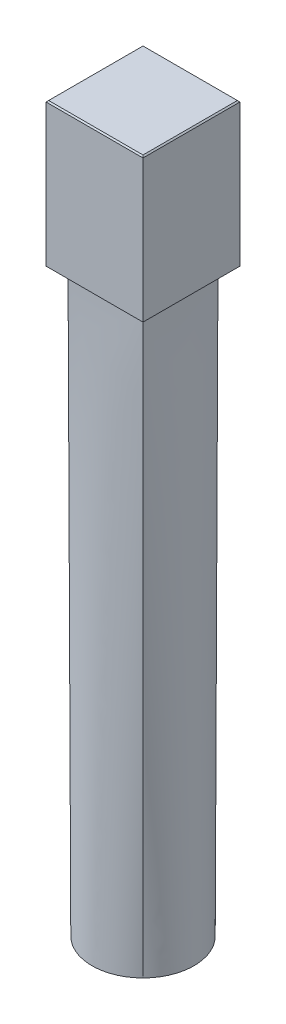
ISO-10303-21;
HEADER;
FILE_DESCRIPTION(('STEP AP214'),'2;1');
FILE_NAME('part.step','',(''),(''),'','','');
FILE_SCHEMA(('AUTOMOTIVE_DESIGN { 1 0 10303 214 1 1 1 1 }'));
ENDSEC;
DATA;
#1=APPLICATION_CONTEXT('core data for automotive mechanical design processes');
#2=APPLICATION_PROTOCOL_DEFINITION('international standard','automotive_design',2000,#1);
#3=PRODUCT_CONTEXT('',#1,'mechanical');
#4=PRODUCT('Part','Part','',(#3));
#5=PRODUCT_RELATED_PRODUCT_CATEGORY('part','',(#4));
#6=PRODUCT_DEFINITION_FORMATION('','',#4);
#7=PRODUCT_DEFINITION_CONTEXT('part definition',#1,'design');
#8=PRODUCT_DEFINITION('design','',#6,#7);
#9=PRODUCT_DEFINITION_SHAPE('','',#8);
#10=(LENGTH_UNIT() NAMED_UNIT(*) SI_UNIT(.MILLI.,.METRE.));
#11=(NAMED_UNIT(*) PLANE_ANGLE_UNIT() SI_UNIT($,.RADIAN.));
#12=(NAMED_UNIT(*) SI_UNIT($,.STERADIAN.) SOLID_ANGLE_UNIT());
#13=UNCERTAINTY_MEASURE_WITH_UNIT(LENGTH_MEASURE(1.E-05),#10,'distance_accuracy_value','');
#14=(GEOMETRIC_REPRESENTATION_CONTEXT(3) GLOBAL_UNCERTAINTY_ASSIGNED_CONTEXT((#13)) GLOBAL_UNIT_ASSIGNED_CONTEXT((#10,
#11,#12)) REPRESENTATION_CONTEXT('',''));
#15=CARTESIAN_POINT('',(0.,0.,0.));
#16=DIRECTION('',(0.,0.,1.));
#17=DIRECTION('',(1.,0.,0.));
#18=AXIS2_PLACEMENT_3D('',#15,#16,#17);
#19=CARTESIAN_POINT('',(0.,0.,0.));
#20=DIRECTION('',(0.,1.,0.));
#21=DIRECTION('',(0.,0.,1.));
#22=AXIS2_PLACEMENT_3D('',#19,#20,#21);
#23=PLANE('',#22);
#24=CARTESIAN_POINT('',(0.,0.,0.));
#25=DIRECTION('',(0.,1.,0.));
#26=DIRECTION('',(0.,0.,1.));
#27=AXIS2_PLACEMENT_3D('',#24,#25,#26);
#28=CIRCLE('',#27,1.975);
#29=CARTESIAN_POINT('',(-1.39653589284343,0.,-1.39653589284343));
#30=VERTEX_POINT('',#29);
#31=CARTESIAN_POINT('',(-1.39653589284343,0.,1.39653589284343));
#32=VERTEX_POINT('',#31);
#33=EDGE_CURVE('E172',#30,#32,#28,.T.);
#34=ORIENTED_EDGE('',*,*,#33,.F.);
#35=CARTESIAN_POINT('',(1.39653589284343,0.,-1.39653589284343));
#36=VERTEX_POINT('',#35);
#37=EDGE_CURVE('E250',#36,#30,#28,.T.);
#38=ORIENTED_EDGE('',*,*,#37,.F.);
#39=CARTESIAN_POINT('',(1.39653589284343,0.,1.39653589284343));
#40=VERTEX_POINT('',#39);
#41=EDGE_CURVE('E255',#40,#36,#28,.T.);
#42=ORIENTED_EDGE('',*,*,#41,.F.);
#43=EDGE_CURVE('E167',#32,#40,#28,.T.);
#44=ORIENTED_EDGE('',*,*,#43,.F.);
#45=EDGE_LOOP('',(#34,#38,#42,#44));
#46=FACE_BOUND('',#45,.T.);
#47=ADVANCED_FACE('F65',(#46),#23,.F.);
#48=CARTESIAN_POINT('',(1.39653589284343,0.,1.39653589284343));
#49=CARTESIAN_POINT('',(1.45,22.4,1.45));
#50=CARTESIAN_POINT('',(1.56111922617677,0.,1.2319525595101));
#51=CARTESIAN_POINT('',(1.45,22.4,1.20833333333333));
#52=CARTESIAN_POINT('',(1.70868822751565,0.,1.0243918987991));
#53=CARTESIAN_POINT('',(1.45,22.4,0.966666666666667));
#54=CARTESIAN_POINT('',(1.91639219058141,0.,0.544458623822229));
#55=CARTESIAN_POINT('',(1.45,22.4,0.483333333333333));
#56=CARTESIAN_POINT('',(1.975,0.,0.272690595228954));
#57=CARTESIAN_POINT('',(1.45,22.4,0.241666666666667));
#58=CARTESIAN_POINT('',(1.975,0.,-0.272690595228954));
#59=CARTESIAN_POINT('',(1.45,22.4,-0.241666666666667));
#60=CARTESIAN_POINT('',(1.91639219058141,0.,-0.544458623822229));
#61=CARTESIAN_POINT('',(1.45,22.4,-0.483333333333333));
#62=CARTESIAN_POINT('',(1.70868822751565,0.,-1.0243918987991));
#63=CARTESIAN_POINT('',(1.45,22.4,-0.966666666666667));
#64=CARTESIAN_POINT('',(1.56111922617677,0.,-1.2319525595101));
#65=CARTESIAN_POINT('',(1.45,22.4,-1.20833333333333));
#66=CARTESIAN_POINT('',(1.39653589284343,0.,-1.39653589284343));
#67=CARTESIAN_POINT('',(1.45,22.4,-1.45));
#68=B_SPLINE_SURFACE_WITH_KNOTS('',3,1,((#48,#49),(#50,#51),(#52,#53),(#54,#55),(#56,#57),(#58,
#59),(#60,#61),(#62,#63),(#64,#65),(#66,#67)),.UNSPECIFIED.,.F.,.F.,.F.,(4,2,2,2,4),(2,2),(0.,
0.25,0.5,0.75,1.),(0.,1.),.UNSPECIFIED.);
#69=DIRECTION('',(0.00238677690118345,0.999994303279798,-0.00238677690118346));
#70=VECTOR('',#69,1.);
#71=CARTESIAN_POINT('',(1.42326794642172,11.2,-1.42326794642172));
#72=LINE('',#71,#70);
#73=CARTESIAN_POINT('',(1.45,22.4,-1.45));
#74=VERTEX_POINT('',#73);
#75=EDGE_CURVE('E171',#36,#74,#72,.T.);
#76=DIRECTION('',(0.,0.,-1.));
#77=VECTOR('',#76,1.);
#78=CARTESIAN_POINT('',(1.45,22.4,1.45));
#79=LINE('',#78,#77);
#80=CARTESIAN_POINT('',(1.45,22.4,1.45));
#81=VERTEX_POINT('',#80);
#82=EDGE_CURVE('E176',#81,#74,#79,.T.);
#83=DIRECTION('',(-0.00238677690118345,-0.999994303279798,-0.00238677690118343));
#84=VECTOR('',#83,1.);
#85=CARTESIAN_POINT('',(1.42326794642172,11.2,1.42326794642172));
#86=LINE('',#85,#84);
#87=EDGE_CURVE('E159',#81,#40,#86,.T.);
#88=ORIENTED_EDGE('',*,*,#41,.T.);
#89=ORIENTED_EDGE('',*,*,#75,.T.);
#90=ORIENTED_EDGE('',*,*,#82,.F.);
#91=ORIENTED_EDGE('',*,*,#87,.T.);
#92=EDGE_LOOP('',(#88,#89,#90,#91));
#93=FACE_BOUND('',#92,.T.);
#94=ADVANCED_FACE('F178',(#93),#68,.T.);
#95=CARTESIAN_POINT('',(1.39653589284343,0.,-1.39653589284343));
#96=CARTESIAN_POINT('',(1.45,22.4,-1.45));
#97=CARTESIAN_POINT('',(1.2319525595101,0.,-1.56111922617676));
#98=CARTESIAN_POINT('',(1.20833333333333,22.4,-1.45));
#99=CARTESIAN_POINT('',(1.0243918987991,0.,-1.70868822751565));
#100=CARTESIAN_POINT('',(0.966666666666667,22.4,-1.45));
#101=CARTESIAN_POINT('',(0.544458623822229,0.,-1.91639219058141));
#102=CARTESIAN_POINT('',(0.483333333333333,22.4,-1.45));
#103=CARTESIAN_POINT('',(0.272690595228955,0.,-1.975));
#104=CARTESIAN_POINT('',(0.241666666666667,22.4,-1.45));
#105=CARTESIAN_POINT('',(-0.272690595228954,0.,-1.975));
#106=CARTESIAN_POINT('',(-0.241666666666667,22.4,-1.45));
#107=CARTESIAN_POINT('',(-0.544458623822229,0.,-1.91639219058141));
#108=CARTESIAN_POINT('',(-0.483333333333333,22.4,-1.45));
#109=CARTESIAN_POINT('',(-1.0243918987991,0.,-1.70868822751565));
#110=CARTESIAN_POINT('',(-0.966666666666666,22.4,-1.45));
#111=CARTESIAN_POINT('',(-1.2319525595101,0.,-1.56111922617677));
#112=CARTESIAN_POINT('',(-1.20833333333333,22.4,-1.45));
#113=CARTESIAN_POINT('',(-1.39653589284343,0.,-1.39653589284343));
#114=CARTESIAN_POINT('',(-1.45,22.4,-1.45));
#115=B_SPLINE_SURFACE_WITH_KNOTS('',3,1,((#95,#96),(#97,#98),(#99,#100),(#101,#102),(#103,#104),
(#105,#106),(#107,#108),(#109,#110),(#111,#112),(#113,#114)),.UNSPECIFIED.,.F.,.F.,.F.,(4,2,2,2,
4),(2,2),(0.,0.25,0.5,0.75,1.),(0.,1.),.UNSPECIFIED.);
#116=DIRECTION('',(-0.00238677690118344,0.999994303279798,-0.00238677690118344));
#117=VECTOR('',#116,1.);
#118=CARTESIAN_POINT('',(-1.42326794642172,11.2,-1.42326794642172));
#119=LINE('',#118,#117);
#120=CARTESIAN_POINT('',(-1.45,22.4,-1.45));
#121=VERTEX_POINT('',#120);
#122=EDGE_CURVE('E503',#30,#121,#119,.T.);
#123=DIRECTION('',(-1.,0.,0.));
#124=VECTOR('',#123,1.);
#125=CARTESIAN_POINT('',(-1.45,22.4,-1.45));
#126=LINE('',#125,#124);
#127=EDGE_CURVE('E183',#74,#121,#126,.T.);
#128=ORIENTED_EDGE('',*,*,#37,.T.);
#129=ORIENTED_EDGE('',*,*,#122,.T.);
#130=ORIENTED_EDGE('',*,*,#127,.F.);
#131=ORIENTED_EDGE('',*,*,#75,.F.);
#132=EDGE_LOOP('',(#128,#129,#130,#131));
#133=FACE_BOUND('',#132,.T.);
#134=ADVANCED_FACE('F423',(#133),#115,.T.);
#135=CARTESIAN_POINT('',(-1.39653589284343,0.,1.39653589284343));
#136=CARTESIAN_POINT('',(-1.45,22.4,1.45));
#137=CARTESIAN_POINT('',(-1.2319525595101,0.,1.56111922617677));
#138=CARTESIAN_POINT('',(-1.20833333333333,22.4,1.45));
#139=CARTESIAN_POINT('',(-1.0243918987991,0.,1.70868822751565));
#140=CARTESIAN_POINT('',(-0.966666666666667,22.4,1.45));
#141=CARTESIAN_POINT('',(-0.544458623822229,0.,1.91639219058141));
#142=CARTESIAN_POINT('',(-0.483333333333334,22.4,1.45));
#143=CARTESIAN_POINT('',(-0.272690595228954,0.,1.975));
#144=CARTESIAN_POINT('',(-0.241666666666668,22.4,1.45));
#145=CARTESIAN_POINT('',(0.272690595228954,0.,1.975));
#146=CARTESIAN_POINT('',(0.241666666666666,22.4,1.45));
#147=CARTESIAN_POINT('',(0.544458623822229,0.,1.91639219058141));
#148=CARTESIAN_POINT('',(0.483333333333333,22.4,1.45));
#149=CARTESIAN_POINT('',(1.0243918987991,0.,1.70868822751565));
#150=CARTESIAN_POINT('',(0.966666666666666,22.4,1.45));
#151=CARTESIAN_POINT('',(1.2319525595101,0.,1.56111922617677));
#152=CARTESIAN_POINT('',(1.20833333333333,22.4,1.45));
#153=CARTESIAN_POINT('',(1.39653589284343,0.,1.39653589284343));
#154=CARTESIAN_POINT('',(1.45,22.4,1.45));
#155=B_SPLINE_SURFACE_WITH_KNOTS('',3,1,((#135,#136),(#137,#138),(#139,#140),(#141,#142),(#143,
#144),(#145,#146),(#147,#148),(#149,#150),(#151,#152),(#153,#154)),.UNSPECIFIED.,.F.,.F.,.F.,(4,
2,2,2,4),(2,2),(0.,0.25,0.5,0.75,1.),(0.,1.),.UNSPECIFIED.);
#156=DIRECTION('',(1.,0.,0.));
#157=VECTOR('',#156,1.);
#158=CARTESIAN_POINT('',(-1.45,22.4,1.45));
#159=LINE('',#158,#157);
#160=CARTESIAN_POINT('',(-1.45,22.4,1.45));
#161=VERTEX_POINT('',#160);
#162=EDGE_CURVE('E163',#161,#81,#159,.T.);
#163=DIRECTION('',(-0.00238677690118342,0.999994303279798,0.00238677690118345));
#164=VECTOR('',#163,1.);
#165=CARTESIAN_POINT('',(-1.42326794642172,11.2,1.42326794642172));
#166=LINE('',#165,#164);
#167=EDGE_CURVE('E184',#32,#161,#166,.T.);
#168=ORIENTED_EDGE('',*,*,#43,.T.);
#169=ORIENTED_EDGE('',*,*,#87,.F.);
#170=ORIENTED_EDGE('',*,*,#162,.F.);
#171=ORIENTED_EDGE('',*,*,#167,.F.);
#172=EDGE_LOOP('',(#168,#169,#170,#171));
#173=FACE_BOUND('',#172,.T.);
#174=ADVANCED_FACE('F161',(#173),#155,.T.);
#175=CARTESIAN_POINT('',(-1.39653589284343,0.,-1.39653589284343));
#176=CARTESIAN_POINT('',(-1.45,22.4,-1.45));
#177=CARTESIAN_POINT('',(-1.56111922617676,0.,-1.2319525595101));
#178=CARTESIAN_POINT('',(-1.45,22.4,-1.20833333333333));
#179=CARTESIAN_POINT('',(-1.70868822751565,0.,-1.0243918987991));
#180=CARTESIAN_POINT('',(-1.45,22.4,-0.966666666666669));
#181=CARTESIAN_POINT('',(-1.91639219058141,0.,-0.54445862382223));
#182=CARTESIAN_POINT('',(-1.45,22.4,-0.483333333333338));
#183=CARTESIAN_POINT('',(-1.975,0.,-0.272690595228955));
#184=CARTESIAN_POINT('',(-1.45,22.4,-0.241666666666672));
#185=CARTESIAN_POINT('',(-1.975,0.,0.272690595228954));
#186=CARTESIAN_POINT('',(-1.45,22.4,0.241666666666662));
#187=CARTESIAN_POINT('',(-1.91639219058141,0.,0.544458623822229));
#188=CARTESIAN_POINT('',(-1.45,22.4,0.483333333333329));
#189=CARTESIAN_POINT('',(-1.70868822751565,0.,1.0243918987991));
#190=CARTESIAN_POINT('',(-1.45,22.4,0.966666666666664));
#191=CARTESIAN_POINT('',(-1.56111922617676,0.,1.2319525595101));
#192=CARTESIAN_POINT('',(-1.45,22.4,1.20833333333333));
#193=CARTESIAN_POINT('',(-1.39653589284343,0.,1.39653589284343));
#194=CARTESIAN_POINT('',(-1.45,22.4,1.45));
#195=B_SPLINE_SURFACE_WITH_KNOTS('',3,1,((#175,#176),(#177,#178),(#179,#180),(#181,#182),(#183,
#184),(#185,#186),(#187,#188),(#189,#190),(#191,#192),(#193,#194)),.UNSPECIFIED.,.F.,.F.,.F.,(4,
2,2,2,4),(2,2),(0.,0.25,0.5,0.75,1.),(0.,1.),.UNSPECIFIED.);
#196=DIRECTION('',(0.,0.,1.));
#197=VECTOR('',#196,1.);
#198=CARTESIAN_POINT('',(-1.45,22.4,1.45));
#199=LINE('',#198,#197);
#200=EDGE_CURVE('E190',#121,#161,#199,.T.);
#201=ORIENTED_EDGE('',*,*,#33,.T.);
#202=ORIENTED_EDGE('',*,*,#167,.T.);
#203=ORIENTED_EDGE('',*,*,#200,.F.);
#204=ORIENTED_EDGE('',*,*,#122,.F.);
#205=EDGE_LOOP('',(#201,#202,#203,#204));
#206=FACE_BOUND('',#205,.T.);
#207=ADVANCED_FACE('F414',(#206),#195,.T.);
#208=CARTESIAN_POINT('',(1.875,28.,1.875));
#209=DIRECTION('',(-1.,0.,0.));
#210=DIRECTION('',(0.,0.,1.));
#211=AXIS2_PLACEMENT_3D('',#208,#209,#210);
#212=PLANE('',#211);
#213=DIRECTION('',(0.,-1.,0.));
#214=VECTOR('',#213,1.);
#215=CARTESIAN_POINT('',(1.875,28.,1.875));
#216=LINE('',#215,#214);
#217=CARTESIAN_POINT('',(1.875,27.95,1.875));
#218=VERTEX_POINT('',#217);
#219=CARTESIAN_POINT('',(1.875,22.45,1.875));
#220=VERTEX_POINT('',#219);
#221=EDGE_CURVE('E345',#218,#220,#216,.T.);
#222=ORIENTED_EDGE('',*,*,#221,.T.);
#223=DIRECTION('',(0.,0.,-1.));
#224=VECTOR('',#223,1.);
#225=CARTESIAN_POINT('',(1.875,22.45,-1.875));
#226=LINE('',#225,#224);
#227=CARTESIAN_POINT('',(1.875,22.45,-1.875));
#228=VERTEX_POINT('',#227);
#229=EDGE_CURVE('E306',#220,#228,#226,.T.);
#230=ORIENTED_EDGE('',*,*,#229,.T.);
#231=DIRECTION('',(0.,-1.,0.));
#232=VECTOR('',#231,1.);
#233=CARTESIAN_POINT('',(1.875,28.,-1.875));
#234=LINE('',#233,#232);
#235=CARTESIAN_POINT('',(1.875,27.95,-1.875));
#236=VERTEX_POINT('',#235);
#237=EDGE_CURVE('E196',#236,#228,#234,.T.);
#238=ORIENTED_EDGE('',*,*,#237,.F.);
#239=DIRECTION('',(0.,0.,1.));
#240=VECTOR('',#239,1.);
#241=CARTESIAN_POINT('',(1.875,27.95,1.875));
#242=LINE('',#241,#240);
#243=EDGE_CURVE('E192',#236,#218,#242,.T.);
#244=ORIENTED_EDGE('',*,*,#243,.T.);
#245=EDGE_LOOP('',(#222,#230,#238,#244));
#246=FACE_BOUND('',#245,.T.);
#247=ADVANCED_FACE('F274',(#246),#212,.F.);
#248=CARTESIAN_POINT('',(-1.875,28.,-1.875));
#249=DIRECTION('',(0.,0.,1.));
#250=DIRECTION('',(1.,0.,0.));
#251=AXIS2_PLACEMENT_3D('',#248,#249,#250);
#252=PLANE('',#251);
#253=ORIENTED_EDGE('',*,*,#237,.T.);
#254=DIRECTION('',(-1.,0.,0.));
#255=VECTOR('',#254,1.);
#256=CARTESIAN_POINT('',(-1.875,22.45,-1.875));
#257=LINE('',#256,#255);
#258=CARTESIAN_POINT('',(-1.875,22.45,-1.875));
#259=VERTEX_POINT('',#258);
#260=EDGE_CURVE('E320',#228,#259,#257,.T.);
#261=ORIENTED_EDGE('',*,*,#260,.T.);
#262=DIRECTION('',(0.,-1.,0.));
#263=VECTOR('',#262,1.);
#264=CARTESIAN_POINT('',(-1.875,28.,-1.875));
#265=LINE('',#264,#263);
#266=CARTESIAN_POINT('',(-1.875,27.95,-1.875));
#267=VERTEX_POINT('',#266);
#268=EDGE_CURVE('E367',#267,#259,#265,.T.);
#269=ORIENTED_EDGE('',*,*,#268,.F.);
#270=DIRECTION('',(1.,0.,0.));
#271=VECTOR('',#270,1.);
#272=CARTESIAN_POINT('',(-1.875,27.95,-1.875));
#273=LINE('',#272,#271);
#274=EDGE_CURVE('E318',#267,#236,#273,.T.);
#275=ORIENTED_EDGE('',*,*,#274,.T.);
#276=EDGE_LOOP('',(#253,#261,#269,#275));
#277=FACE_BOUND('',#276,.T.);
#278=ADVANCED_FACE('F365',(#277),#252,.F.);
#279=CARTESIAN_POINT('',(-1.875,28.,1.875));
#280=DIRECTION('',(1.,0.,0.));
#281=DIRECTION('',(0.,0.,-1.));
#282=AXIS2_PLACEMENT_3D('',#279,#280,#281);
#283=PLANE('',#282);
#284=ORIENTED_EDGE('',*,*,#268,.T.);
#285=DIRECTION('',(0.,0.,1.));
#286=VECTOR('',#285,1.);
#287=CARTESIAN_POINT('',(-1.875,22.45,1.875));
#288=LINE('',#287,#286);
#289=CARTESIAN_POINT('',(-1.875,22.45,1.875));
#290=VERTEX_POINT('',#289);
#291=EDGE_CURVE('E324',#259,#290,#288,.T.);
#292=ORIENTED_EDGE('',*,*,#291,.T.);
#293=DIRECTION('',(0.,-1.,0.));
#294=VECTOR('',#293,1.);
#295=CARTESIAN_POINT('',(-1.875,28.,1.875));
#296=LINE('',#295,#294);
#297=CARTESIAN_POINT('',(-1.875,27.95,1.875));
#298=VERTEX_POINT('',#297);
#299=EDGE_CURVE('E373',#298,#290,#296,.T.);
#300=ORIENTED_EDGE('',*,*,#299,.F.);
#301=DIRECTION('',(0.,0.,-1.));
#302=VECTOR('',#301,1.);
#303=CARTESIAN_POINT('',(-1.875,27.95,1.875));
#304=LINE('',#303,#302);
#305=EDGE_CURVE('E322',#298,#267,#304,.T.);
#306=ORIENTED_EDGE('',*,*,#305,.T.);
#307=EDGE_LOOP('',(#284,#292,#300,#306));
#308=FACE_BOUND('',#307,.T.);
#309=ADVANCED_FACE('F398',(#308),#283,.F.);
#310=CARTESIAN_POINT('',(-1.875,28.,1.875));
#311=DIRECTION('',(0.,0.,-1.));
#312=DIRECTION('',(-1.,0.,0.));
#313=AXIS2_PLACEMENT_3D('',#310,#311,#312);
#314=PLANE('',#313);
#315=ORIENTED_EDGE('',*,*,#299,.T.);
#316=DIRECTION('',(1.,0.,0.));
#317=VECTOR('',#316,1.);
#318=CARTESIAN_POINT('',(1.875,22.45,1.875));
#319=LINE('',#318,#317);
#320=EDGE_CURVE('E329',#290,#220,#319,.T.);
#321=ORIENTED_EDGE('',*,*,#320,.T.);
#322=ORIENTED_EDGE('',*,*,#221,.F.);
#323=DIRECTION('',(-1.,0.,0.));
#324=VECTOR('',#323,1.);
#325=CARTESIAN_POINT('',(-1.875,27.95,1.875));
#326=LINE('',#325,#324);
#327=EDGE_CURVE('E326',#218,#298,#326,.T.);
#328=ORIENTED_EDGE('',*,*,#327,.T.);
#329=EDGE_LOOP('',(#315,#321,#322,#328));
#330=FACE_BOUND('',#329,.T.);
#331=ADVANCED_FACE('F214',(#330),#314,.F.);
#332=CARTESIAN_POINT('',(0.,28.,0.));
#333=DIRECTION('',(0.,-1.,0.));
#334=DIRECTION('',(0.,0.,-1.));
#335=AXIS2_PLACEMENT_3D('',#332,#333,#334);
#336=PLANE('',#335);
#337=DIRECTION('',(0.,0.,1.));
#338=VECTOR('',#337,1.);
#339=CARTESIAN_POINT('',(-1.825,28.,0.));
#340=LINE('',#339,#338);
#341=CARTESIAN_POINT('',(-1.825,28.,-1.825));
#342=VERTEX_POINT('',#341);
#343=CARTESIAN_POINT('',(-1.825,28.,1.82499999999999));
#344=VERTEX_POINT('',#343);
#345=EDGE_CURVE('E90',#342,#344,#340,.T.);
#346=ORIENTED_EDGE('',*,*,#345,.T.);
#347=DIRECTION('',(1.,0.,0.));
#348=VECTOR('',#347,1.);
#349=CARTESIAN_POINT('',(0.,28.,1.82499999999999));
#350=LINE('',#349,#348);
#351=CARTESIAN_POINT('',(1.82499999999999,28.,1.82499999999999));
#352=VERTEX_POINT('',#351);
#353=EDGE_CURVE('E12',#344,#352,#350,.T.);
#354=ORIENTED_EDGE('',*,*,#353,.T.);
#355=DIRECTION('',(0.,0.,-1.));
#356=VECTOR('',#355,1.);
#357=CARTESIAN_POINT('',(1.82499999999999,28.,0.));
#358=LINE('',#357,#356);
#359=CARTESIAN_POINT('',(1.82499999999999,28.,-1.825));
#360=VERTEX_POINT('',#359);
#361=EDGE_CURVE('E75',#352,#360,#358,.T.);
#362=ORIENTED_EDGE('',*,*,#361,.T.);
#363=DIRECTION('',(-1.,0.,0.));
#364=VECTOR('',#363,1.);
#365=CARTESIAN_POINT('',(0.,28.,-1.825));
#366=LINE('',#365,#364);
#367=EDGE_CURVE('E331',#360,#342,#366,.T.);
#368=ORIENTED_EDGE('',*,*,#367,.T.);
#369=EDGE_LOOP('',(#346,#354,#362,#368));
#370=FACE_BOUND('',#369,.T.);
#371=ADVANCED_FACE('F212',(#370),#336,.F.);
#372=CARTESIAN_POINT('',(0.,22.4,0.));
#373=DIRECTION('',(0.,-1.,0.));
#374=DIRECTION('',(0.,0.,-1.));
#375=AXIS2_PLACEMENT_3D('',#372,#373,#374);
#376=PLANE('',#375);
#377=DIRECTION('',(1.,0.,0.));
#378=VECTOR('',#377,1.);
#379=CARTESIAN_POINT('',(1.875,22.4,-1.825));
#380=LINE('',#379,#378);
#381=CARTESIAN_POINT('',(-1.825,22.4,-1.825));
#382=VERTEX_POINT('',#381);
#383=CARTESIAN_POINT('',(1.825,22.4,-1.825));
#384=VERTEX_POINT('',#383);
#385=EDGE_CURVE('E313',#382,#384,#380,.T.);
#386=ORIENTED_EDGE('',*,*,#385,.T.);
#387=DIRECTION('',(0.,0.,1.));
#388=VECTOR('',#387,1.);
#389=CARTESIAN_POINT('',(1.825,22.4,1.875));
#390=LINE('',#389,#388);
#391=CARTESIAN_POINT('',(1.825,22.4,1.825));
#392=VERTEX_POINT('',#391);
#393=EDGE_CURVE('E315',#384,#392,#390,.T.);
#394=ORIENTED_EDGE('',*,*,#393,.T.);
#395=DIRECTION('',(-1.,0.,0.));
#396=VECTOR('',#395,1.);
#397=CARTESIAN_POINT('',(-1.875,22.4,1.825));
#398=LINE('',#397,#396);
#399=CARTESIAN_POINT('',(-1.825,22.4,1.825));
#400=VERTEX_POINT('',#399);
#401=EDGE_CURVE('E309',#392,#400,#398,.T.);
#402=ORIENTED_EDGE('',*,*,#401,.T.);
#403=DIRECTION('',(0.,0.,-1.));
#404=VECTOR('',#403,1.);
#405=CARTESIAN_POINT('',(-1.825,22.4,-1.875));
#406=LINE('',#405,#404);
#407=EDGE_CURVE('E311',#400,#382,#406,.T.);
#408=ORIENTED_EDGE('',*,*,#407,.T.);
#409=EDGE_LOOP('',(#386,#394,#402,#408));
#410=FACE_BOUND('',#409,.T.);
#411=ORIENTED_EDGE('',*,*,#162,.T.);
#412=ORIENTED_EDGE('',*,*,#82,.T.);
#413=ORIENTED_EDGE('',*,*,#127,.T.);
#414=ORIENTED_EDGE('',*,*,#200,.T.);
#415=EDGE_LOOP('',(#411,#412,#413,#414));
#416=FACE_BOUND('',#415,.T.);
#417=ADVANCED_FACE('F189',(#410,#416),#376,.T.);
#418=CARTESIAN_POINT('',(-1.875,22.45,1.875));
#419=DIRECTION('',(-0.707106781186548,-0.707106781186548,0.));
#420=DIRECTION('',(0.,0.,-1.));
#421=AXIS2_PLACEMENT_3D('',#418,#419,#420);
#422=PLANE('',#421);
#423=DIRECTION('',(0.577350269189626,-0.577350269189626,0.577350269189626));
#424=VECTOR('',#423,1.);
#425=CARTESIAN_POINT('',(-0.625,21.2,-0.625));
#426=LINE('',#425,#424);
#427=EDGE_CURVE('E339',#382,#259,#426,.F.);
#428=ORIENTED_EDGE('',*,*,#427,.F.);
#429=ORIENTED_EDGE('',*,*,#407,.F.);
#430=DIRECTION('',(0.577350269189626,-0.577350269189626,-0.577350269189626));
#431=VECTOR('',#430,1.);
#432=CARTESIAN_POINT('',(-1.875,22.45,1.875));
#433=LINE('',#432,#431);
#434=EDGE_CURVE('E342',#290,#400,#433,.T.);
#435=ORIENTED_EDGE('',*,*,#434,.F.);
#436=ORIENTED_EDGE('',*,*,#291,.F.);
#437=EDGE_LOOP('',(#428,#429,#435,#436));
#438=FACE_BOUND('',#437,.T.);
#439=ADVANCED_FACE('F211',(#438),#422,.T.);
#440=CARTESIAN_POINT('',(-1.875,22.45,1.875));
#441=DIRECTION('',(0.,-0.707106781186548,0.707106781186548));
#442=DIRECTION('',(-1.,0.,0.));
#443=AXIS2_PLACEMENT_3D('',#440,#441,#442);
#444=PLANE('',#443);
#445=ORIENTED_EDGE('',*,*,#434,.T.);
#446=ORIENTED_EDGE('',*,*,#401,.F.);
#447=DIRECTION('',(0.577350269189626,0.577350269189626,0.577350269189626));
#448=VECTOR('',#447,1.);
#449=CARTESIAN_POINT('',(0.624999999999999,21.2,0.625));
#450=LINE('',#449,#448);
#451=EDGE_CURVE('E337',#220,#392,#450,.F.);
#452=ORIENTED_EDGE('',*,*,#451,.F.);
#453=ORIENTED_EDGE('',*,*,#320,.F.);
#454=EDGE_LOOP('',(#445,#446,#452,#453));
#455=FACE_BOUND('',#454,.T.);
#456=ADVANCED_FACE('F384',(#455),#444,.T.);
#457=CARTESIAN_POINT('',(-1.875,22.45,-1.875));
#458=DIRECTION('',(0.,-0.707106781186548,-0.707106781186548));
#459=DIRECTION('',(1.,0.,0.));
#460=AXIS2_PLACEMENT_3D('',#457,#458,#459);
#461=PLANE('',#460);
#462=ORIENTED_EDGE('',*,*,#427,.T.);
#463=ORIENTED_EDGE('',*,*,#260,.F.);
#464=DIRECTION('',(-0.577350269189626,-0.577350269189626,0.577350269189626));
#465=VECTOR('',#464,1.);
#466=CARTESIAN_POINT('',(0.624999999999999,21.2,-0.625));
#467=LINE('',#466,#465);
#468=EDGE_CURVE('E335',#384,#228,#467,.F.);
#469=ORIENTED_EDGE('',*,*,#468,.F.);
#470=ORIENTED_EDGE('',*,*,#385,.F.);
#471=EDGE_LOOP('',(#462,#463,#469,#470));
#472=FACE_BOUND('',#471,.T.);
#473=ADVANCED_FACE('F392',(#472),#461,.T.);
#474=CARTESIAN_POINT('',(1.875,22.45,1.875));
#475=DIRECTION('',(0.707106781186548,-0.707106781186548,0.));
#476=DIRECTION('',(0.,0.,1.));
#477=AXIS2_PLACEMENT_3D('',#474,#475,#476);
#478=PLANE('',#477);
#479=ORIENTED_EDGE('',*,*,#451,.T.);
#480=ORIENTED_EDGE('',*,*,#393,.F.);
#481=ORIENTED_EDGE('',*,*,#468,.T.);
#482=ORIENTED_EDGE('',*,*,#229,.F.);
#483=EDGE_LOOP('',(#479,#480,#481,#482));
#484=FACE_BOUND('',#483,.T.);
#485=ADVANCED_FACE('F387',(#484),#478,.T.);
#486=CARTESIAN_POINT('',(0.,28.,-1.825));
#487=DIRECTION('',(0.,-0.707106781186548,0.707106781186548));
#488=DIRECTION('',(-1.,0.,0.));
#489=AXIS2_PLACEMENT_3D('',#486,#487,#488);
#490=PLANE('',#489);
#491=DIRECTION('',(0.577350269189626,-0.577350269189626,-0.577350269189626));
#492=VECTOR('',#491,1.);
#493=CARTESIAN_POINT('',(1.21666666666666,28.6083333333333,-1.21666666666666));
#494=LINE('',#493,#492);
#495=EDGE_CURVE('E348',#236,#360,#494,.F.);
#496=ORIENTED_EDGE('',*,*,#495,.F.);
#497=ORIENTED_EDGE('',*,*,#274,.F.);
#498=DIRECTION('',(0.577350269189626,0.577350269189626,0.577350269189626));
#499=VECTOR('',#498,1.);
#500=CARTESIAN_POINT('',(-1.21666666666666,28.6083333333333,-1.21666666666666));
#501=LINE('',#500,#499);
#502=EDGE_CURVE('E70',#342,#267,#501,.F.);
#503=ORIENTED_EDGE('',*,*,#502,.F.);
#504=ORIENTED_EDGE('',*,*,#367,.F.);
#505=EDGE_LOOP('',(#496,#497,#503,#504));
#506=FACE_BOUND('',#505,.T.);
#507=ADVANCED_FACE('F68',(#506),#490,.F.);
#508=CARTESIAN_POINT('',(-1.825,28.,0.));
#509=DIRECTION('',(0.707106781186548,-0.707106781186548,0.));
#510=DIRECTION('',(0.,0.,1.));
#511=AXIS2_PLACEMENT_3D('',#508,#509,#510);
#512=PLANE('',#511);
#513=ORIENTED_EDGE('',*,*,#502,.T.);
#514=ORIENTED_EDGE('',*,*,#305,.F.);
#515=DIRECTION('',(0.577350269189626,0.577350269189626,-0.577350269189626));
#516=VECTOR('',#515,1.);
#517=CARTESIAN_POINT('',(-1.21666666666666,28.6083333333333,1.21666666666666));
#518=LINE('',#517,#516);
#519=EDGE_CURVE('E347',#344,#298,#518,.F.);
#520=ORIENTED_EDGE('',*,*,#519,.F.);
#521=ORIENTED_EDGE('',*,*,#345,.F.);
#522=EDGE_LOOP('',(#513,#514,#520,#521));
#523=FACE_BOUND('',#522,.T.);
#524=ADVANCED_FACE('F357',(#523),#512,.F.);
#525=CARTESIAN_POINT('',(1.82499999999999,28.,0.));
#526=DIRECTION('',(-0.707106781186548,-0.707106781186548,0.));
#527=DIRECTION('',(0.,0.,-1.));
#528=AXIS2_PLACEMENT_3D('',#525,#526,#527);
#529=PLANE('',#528);
#530=ORIENTED_EDGE('',*,*,#495,.T.);
#531=ORIENTED_EDGE('',*,*,#361,.F.);
#532=DIRECTION('',(0.577350269189626,-0.577350269189626,0.577350269189626));
#533=VECTOR('',#532,1.);
#534=CARTESIAN_POINT('',(1.21666666666666,28.6083333333333,1.21666666666666));
#535=LINE('',#534,#533);
#536=EDGE_CURVE('E83',#218,#352,#535,.F.);
#537=ORIENTED_EDGE('',*,*,#536,.F.);
#538=ORIENTED_EDGE('',*,*,#243,.F.);
#539=EDGE_LOOP('',(#530,#531,#537,#538));
#540=FACE_BOUND('',#539,.T.);
#541=ADVANCED_FACE('F400',(#540),#529,.F.);
#542=CARTESIAN_POINT('',(0.,28.,1.82499999999999));
#543=DIRECTION('',(0.,-0.707106781186548,-0.707106781186548));
#544=DIRECTION('',(1.,0.,0.));
#545=AXIS2_PLACEMENT_3D('',#542,#543,#544);
#546=PLANE('',#545);
#547=ORIENTED_EDGE('',*,*,#519,.T.);
#548=ORIENTED_EDGE('',*,*,#327,.F.);
#549=ORIENTED_EDGE('',*,*,#536,.T.);
#550=ORIENTED_EDGE('',*,*,#353,.F.);
#551=EDGE_LOOP('',(#547,#548,#549,#550));
#552=FACE_BOUND('',#551,.T.);
#553=ADVANCED_FACE('F399',(#552),#546,.F.);
#554=CLOSED_SHELL('',(#47,#94,#134,#174,#207,#247,#278,#309,#331,#371,#417,#439,#456,#473,#485,
#507,#524,#541,#553));
#555=MANIFOLD_SOLID_BREP('B2',#554);
#556=ADVANCED_BREP_SHAPE_REPRESENTATION('',(#18,#555),#14);
#557=SHAPE_DEFINITION_REPRESENTATION(#9,#556);
ENDSEC;
END-ISO-10303-21;
